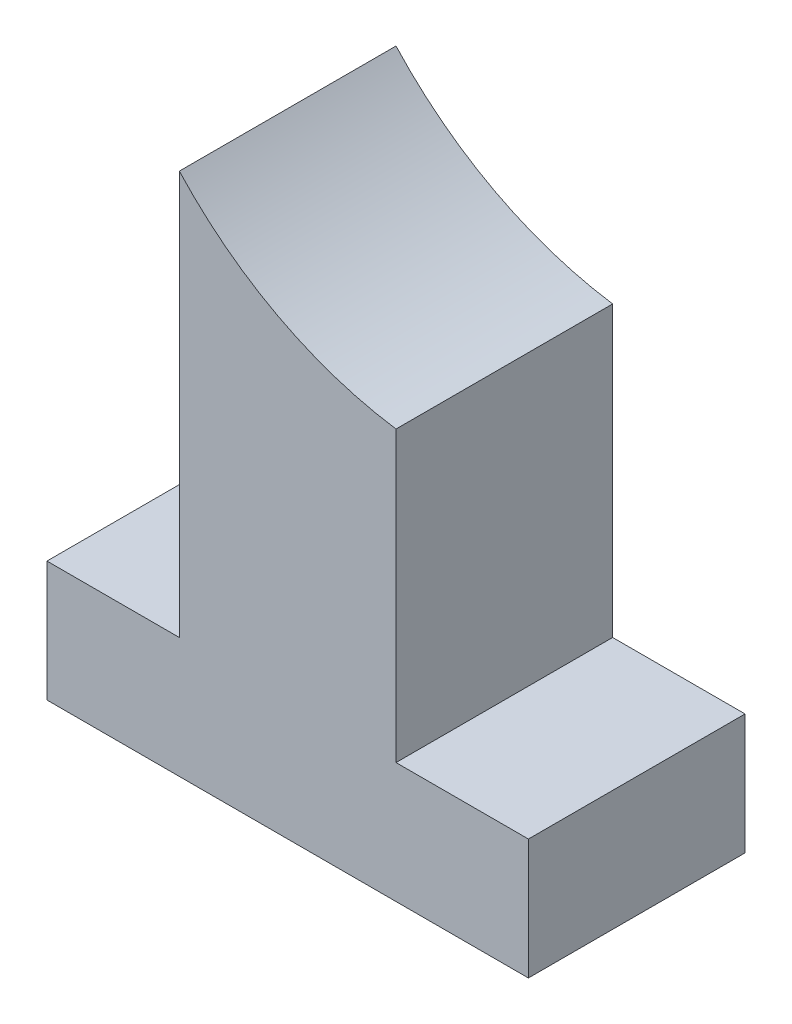
ISO-10303-21;
HEADER;
FILE_DESCRIPTION(('STEP AP214'),'2;1');
FILE_NAME('part.step','',(''),(''),'','','');
FILE_SCHEMA(('AUTOMOTIVE_DESIGN { 1 0 10303 214 1 1 1 1 }'));
ENDSEC;
DATA;
#1=APPLICATION_CONTEXT('core data for automotive mechanical design processes');
#2=APPLICATION_PROTOCOL_DEFINITION('international standard','automotive_design',2000,#1);
#3=PRODUCT_CONTEXT('',#1,'mechanical');
#4=PRODUCT('Part','Part','',(#3));
#5=PRODUCT_RELATED_PRODUCT_CATEGORY('part','',(#4));
#6=PRODUCT_DEFINITION_FORMATION('','',#4);
#7=PRODUCT_DEFINITION_CONTEXT('part definition',#1,'design');
#8=PRODUCT_DEFINITION('design','',#6,#7);
#9=PRODUCT_DEFINITION_SHAPE('','',#8);
#10=(LENGTH_UNIT() NAMED_UNIT(*) SI_UNIT(.MILLI.,.METRE.));
#11=(NAMED_UNIT(*) PLANE_ANGLE_UNIT() SI_UNIT($,.RADIAN.));
#12=(NAMED_UNIT(*) SI_UNIT($,.STERADIAN.) SOLID_ANGLE_UNIT());
#13=UNCERTAINTY_MEASURE_WITH_UNIT(LENGTH_MEASURE(1.E-05),#10,'distance_accuracy_value','');
#14=(GEOMETRIC_REPRESENTATION_CONTEXT(3) GLOBAL_UNCERTAINTY_ASSIGNED_CONTEXT((#13)) GLOBAL_UNIT_ASSIGNED_CONTEXT((#10,
#11,#12)) REPRESENTATION_CONTEXT('',''));
#15=CARTESIAN_POINT('',(0.,0.,0.));
#16=DIRECTION('',(0.,0.,1.));
#17=DIRECTION('',(1.,0.,0.));
#18=AXIS2_PLACEMENT_3D('',#15,#16,#17);
#19=CARTESIAN_POINT('',(837.293394128725,1604.69145591762,450.));
#20=DIRECTION('',(0.,0.,-1.));
#21=DIRECTION('',(-1.,0.,0.));
#22=AXIS2_PLACEMENT_3D('',#19,#20,#21);
#23=CYLINDRICAL_SURFACE('',#22,763.);
#24=CARTESIAN_POINT('',(837.293394128725,1604.69145591762,0.));
#25=DIRECTION('',(0.,0.,-1.));
#26=DIRECTION('',(1.,0.,0.));
#27=AXIS2_PLACEMENT_3D('',#24,#25,#26);
#28=CIRCLE('',#27,763.);
#29=CARTESIAN_POINT('',(725.,850.,0.));
#30=VERTEX_POINT('',#29);
#31=CARTESIAN_POINT('',(275.,1088.94429022575,0.));
#32=VERTEX_POINT('',#31);
#33=EDGE_CURVE('E140',#30,#32,#28,.T.);
#34=ORIENTED_EDGE('',*,*,#33,.T.);
#35=DIRECTION('',(0.,0.,-1.));
#36=VECTOR('',#35,1.);
#37=CARTESIAN_POINT('',(275.,1088.94429022575,450.));
#38=LINE('',#37,#36);
#39=CARTESIAN_POINT('',(275.,1088.94429022575,450.));
#40=VERTEX_POINT('',#39);
#41=EDGE_CURVE('E11',#40,#32,#38,.T.);
#42=ORIENTED_EDGE('',*,*,#41,.F.);
#43=CARTESIAN_POINT('',(837.293394128725,1604.69145591762,450.));
#44=DIRECTION('',(0.,0.,-1.));
#45=DIRECTION('',(1.,0.,0.));
#46=AXIS2_PLACEMENT_3D('',#43,#44,#45);
#47=CIRCLE('',#46,763.);
#48=CARTESIAN_POINT('',(725.,850.,450.));
#49=VERTEX_POINT('',#48);
#50=EDGE_CURVE('E162',#49,#40,#47,.T.);
#51=ORIENTED_EDGE('',*,*,#50,.F.);
#52=DIRECTION('',(0.,0.,-1.));
#53=VECTOR('',#52,1.);
#54=CARTESIAN_POINT('',(725.,850.,450.));
#55=LINE('',#54,#53);
#56=EDGE_CURVE('E136',#49,#30,#55,.T.);
#57=ORIENTED_EDGE('',*,*,#56,.T.);
#58=EDGE_LOOP('',(#34,#42,#51,#57));
#59=FACE_BOUND('',#58,.T.);
#60=ADVANCED_FACE('F39',(#59),#23,.F.);
#61=CARTESIAN_POINT('',(275.,1088.94429022575,450.));
#62=DIRECTION('',(1.,0.,0.));
#63=DIRECTION('',(0.,1.,0.));
#64=AXIS2_PLACEMENT_3D('',#61,#62,#63);
#65=PLANE('',#64);
#66=DIRECTION('',(0.,-1.,0.));
#67=VECTOR('',#66,1.);
#68=CARTESIAN_POINT('',(275.,1088.94429022575,0.));
#69=LINE('',#68,#67);
#70=CARTESIAN_POINT('',(275.,250.,0.));
#71=VERTEX_POINT('',#70);
#72=EDGE_CURVE('E144',#32,#71,#69,.T.);
#73=ORIENTED_EDGE('',*,*,#72,.T.);
#74=DIRECTION('',(0.,0.,-1.));
#75=VECTOR('',#74,1.);
#76=CARTESIAN_POINT('',(275.,250.,450.));
#77=LINE('',#76,#75);
#78=CARTESIAN_POINT('',(275.,250.,450.));
#79=VERTEX_POINT('',#78);
#80=EDGE_CURVE('E48',#79,#71,#77,.T.);
#81=ORIENTED_EDGE('',*,*,#80,.F.);
#82=DIRECTION('',(0.,-1.,0.));
#83=VECTOR('',#82,1.);
#84=CARTESIAN_POINT('',(275.,1088.94429022575,450.));
#85=LINE('',#84,#83);
#86=EDGE_CURVE('E99',#40,#79,#85,.T.);
#87=ORIENTED_EDGE('',*,*,#86,.F.);
#88=ORIENTED_EDGE('',*,*,#41,.T.);
#89=EDGE_LOOP('',(#73,#81,#87,#88));
#90=FACE_BOUND('',#89,.T.);
#91=ADVANCED_FACE('F208',(#90),#65,.F.);
#92=CARTESIAN_POINT('',(275.,250.,450.));
#93=DIRECTION('',(0.,-1.,0.));
#94=DIRECTION('',(0.,0.,-1.));
#95=AXIS2_PLACEMENT_3D('',#92,#93,#94);
#96=PLANE('',#95);
#97=DIRECTION('',(-1.,0.,0.));
#98=VECTOR('',#97,1.);
#99=CARTESIAN_POINT('',(275.,250.,0.));
#100=LINE('',#99,#98);
#101=CARTESIAN_POINT('',(-1.11022302462516E-13,250.,0.));
#102=VERTEX_POINT('',#101);
#103=EDGE_CURVE('E147',#71,#102,#100,.T.);
#104=ORIENTED_EDGE('',*,*,#103,.T.);
#105=DIRECTION('',(0.,0.,-1.));
#106=VECTOR('',#105,1.);
#107=CARTESIAN_POINT('',(-1.11022302462516E-13,250.,450.));
#108=LINE('',#107,#106);
#109=CARTESIAN_POINT('',(-1.11022302462516E-13,250.,450.));
#110=VERTEX_POINT('',#109);
#111=EDGE_CURVE('E173',#110,#102,#108,.T.);
#112=ORIENTED_EDGE('',*,*,#111,.F.);
#113=DIRECTION('',(-1.,0.,0.));
#114=VECTOR('',#113,1.);
#115=CARTESIAN_POINT('',(275.,250.,450.));
#116=LINE('',#115,#114);
#117=EDGE_CURVE('E183',#79,#110,#116,.T.);
#118=ORIENTED_EDGE('',*,*,#117,.F.);
#119=ORIENTED_EDGE('',*,*,#80,.T.);
#120=EDGE_LOOP('',(#104,#112,#118,#119));
#121=FACE_BOUND('',#120,.T.);
#122=ADVANCED_FACE('F181',(#121),#96,.F.);
#123=CARTESIAN_POINT('',(-1.11022302462516E-13,250.,450.));
#124=DIRECTION('',(1.,0.,0.));
#125=DIRECTION('',(0.,1.,0.));
#126=AXIS2_PLACEMENT_3D('',#123,#124,#125);
#127=PLANE('',#126);
#128=DIRECTION('',(0.,-1.,0.));
#129=VECTOR('',#128,1.);
#130=CARTESIAN_POINT('',(-1.11022302462516E-13,250.,0.));
#131=LINE('',#130,#129);
#132=CARTESIAN_POINT('',(0.,0.,0.));
#133=VERTEX_POINT('',#132);
#134=EDGE_CURVE('E150',#102,#133,#131,.T.);
#135=ORIENTED_EDGE('',*,*,#134,.T.);
#136=DIRECTION('',(0.,0.,-1.));
#137=VECTOR('',#136,1.);
#138=CARTESIAN_POINT('',(0.,0.,450.));
#139=LINE('',#138,#137);
#140=CARTESIAN_POINT('',(0.,0.,450.));
#141=VERTEX_POINT('',#140);
#142=EDGE_CURVE('E169',#141,#133,#139,.T.);
#143=ORIENTED_EDGE('',*,*,#142,.F.);
#144=DIRECTION('',(0.,-1.,0.));
#145=VECTOR('',#144,1.);
#146=CARTESIAN_POINT('',(-1.11022302462516E-13,250.,450.));
#147=LINE('',#146,#145);
#148=EDGE_CURVE('E196',#110,#141,#147,.T.);
#149=ORIENTED_EDGE('',*,*,#148,.F.);
#150=ORIENTED_EDGE('',*,*,#111,.T.);
#151=EDGE_LOOP('',(#135,#143,#149,#150));
#152=FACE_BOUND('',#151,.T.);
#153=ADVANCED_FACE('F191',(#152),#127,.F.);
#154=CARTESIAN_POINT('',(0.,0.,450.));
#155=DIRECTION('',(0.,1.,0.));
#156=DIRECTION('',(0.,0.,1.));
#157=AXIS2_PLACEMENT_3D('',#154,#155,#156);
#158=PLANE('',#157);
#159=DIRECTION('',(1.,0.,0.));
#160=VECTOR('',#159,1.);
#161=CARTESIAN_POINT('',(0.,0.,0.));
#162=LINE('',#161,#160);
#163=CARTESIAN_POINT('',(1000.,0.,0.));
#164=VERTEX_POINT('',#163);
#165=EDGE_CURVE('E153',#133,#164,#162,.T.);
#166=ORIENTED_EDGE('',*,*,#165,.T.);
#167=DIRECTION('',(0.,0.,-1.));
#168=VECTOR('',#167,1.);
#169=CARTESIAN_POINT('',(1000.,0.,450.));
#170=LINE('',#169,#168);
#171=CARTESIAN_POINT('',(1000.,0.,450.));
#172=VERTEX_POINT('',#171);
#173=EDGE_CURVE('E129',#172,#164,#170,.T.);
#174=ORIENTED_EDGE('',*,*,#173,.F.);
#175=DIRECTION('',(1.,0.,0.));
#176=VECTOR('',#175,1.);
#177=CARTESIAN_POINT('',(0.,0.,450.));
#178=LINE('',#177,#176);
#179=EDGE_CURVE('E118',#141,#172,#178,.T.);
#180=ORIENTED_EDGE('',*,*,#179,.F.);
#181=ORIENTED_EDGE('',*,*,#142,.T.);
#182=EDGE_LOOP('',(#166,#174,#180,#181));
#183=FACE_BOUND('',#182,.T.);
#184=ADVANCED_FACE('F194',(#183),#158,.F.);
#185=CARTESIAN_POINT('',(1000.,0.,450.));
#186=DIRECTION('',(-1.,0.,0.));
#187=DIRECTION('',(0.,0.,1.));
#188=AXIS2_PLACEMENT_3D('',#185,#186,#187);
#189=PLANE('',#188);
#190=DIRECTION('',(0.,1.,0.));
#191=VECTOR('',#190,1.);
#192=CARTESIAN_POINT('',(1000.,0.,0.));
#193=LINE('',#192,#191);
#194=CARTESIAN_POINT('',(1000.,250.,0.));
#195=VERTEX_POINT('',#194);
#196=EDGE_CURVE('E127',#164,#195,#193,.T.);
#197=ORIENTED_EDGE('',*,*,#196,.T.);
#198=DIRECTION('',(0.,0.,-1.));
#199=VECTOR('',#198,1.);
#200=CARTESIAN_POINT('',(1000.,250.,450.));
#201=LINE('',#200,#199);
#202=CARTESIAN_POINT('',(1000.,250.,450.));
#203=VERTEX_POINT('',#202);
#204=EDGE_CURVE('E124',#203,#195,#201,.T.);
#205=ORIENTED_EDGE('',*,*,#204,.F.);
#206=DIRECTION('',(0.,1.,0.));
#207=VECTOR('',#206,1.);
#208=CARTESIAN_POINT('',(1000.,0.,450.));
#209=LINE('',#208,#207);
#210=EDGE_CURVE('E112',#172,#203,#209,.T.);
#211=ORIENTED_EDGE('',*,*,#210,.F.);
#212=ORIENTED_EDGE('',*,*,#173,.T.);
#213=EDGE_LOOP('',(#197,#205,#211,#212));
#214=FACE_BOUND('',#213,.T.);
#215=ADVANCED_FACE('F125',(#214),#189,.F.);
#216=CARTESIAN_POINT('',(1000.,250.,450.));
#217=DIRECTION('',(0.,-1.,0.));
#218=DIRECTION('',(0.,0.,-1.));
#219=AXIS2_PLACEMENT_3D('',#216,#217,#218);
#220=PLANE('',#219);
#221=DIRECTION('',(-1.,0.,0.));
#222=VECTOR('',#221,1.);
#223=CARTESIAN_POINT('',(1000.,250.,0.));
#224=LINE('',#223,#222);
#225=CARTESIAN_POINT('',(725.,250.,0.));
#226=VERTEX_POINT('',#225);
#227=EDGE_CURVE('E85',#195,#226,#224,.T.);
#228=ORIENTED_EDGE('',*,*,#227,.T.);
#229=DIRECTION('',(0.,0.,-1.));
#230=VECTOR('',#229,1.);
#231=CARTESIAN_POINT('',(725.,250.,450.));
#232=LINE('',#231,#230);
#233=CARTESIAN_POINT('',(725.,250.,450.));
#234=VERTEX_POINT('',#233);
#235=EDGE_CURVE('E130',#234,#226,#232,.T.);
#236=ORIENTED_EDGE('',*,*,#235,.F.);
#237=DIRECTION('',(-1.,0.,0.));
#238=VECTOR('',#237,1.);
#239=CARTESIAN_POINT('',(1000.,250.,450.));
#240=LINE('',#239,#238);
#241=EDGE_CURVE('E116',#203,#234,#240,.T.);
#242=ORIENTED_EDGE('',*,*,#241,.F.);
#243=ORIENTED_EDGE('',*,*,#204,.T.);
#244=EDGE_LOOP('',(#228,#236,#242,#243));
#245=FACE_BOUND('',#244,.T.);
#246=ADVANCED_FACE('F132',(#245),#220,.F.);
#247=CARTESIAN_POINT('',(725.,250.,450.));
#248=DIRECTION('',(-1.,0.,0.));
#249=DIRECTION('',(0.,-1.,0.));
#250=AXIS2_PLACEMENT_3D('',#247,#248,#249);
#251=PLANE('',#250);
#252=DIRECTION('',(0.,1.,0.));
#253=VECTOR('',#252,1.);
#254=CARTESIAN_POINT('',(725.,250.,0.));
#255=LINE('',#254,#253);
#256=EDGE_CURVE('E91',#226,#30,#255,.T.);
#257=ORIENTED_EDGE('',*,*,#256,.T.);
#258=ORIENTED_EDGE('',*,*,#56,.F.);
#259=DIRECTION('',(0.,1.,0.));
#260=VECTOR('',#259,1.);
#261=CARTESIAN_POINT('',(725.,250.,450.));
#262=LINE('',#261,#260);
#263=EDGE_CURVE('E56',#234,#49,#262,.T.);
#264=ORIENTED_EDGE('',*,*,#263,.F.);
#265=ORIENTED_EDGE('',*,*,#235,.T.);
#266=EDGE_LOOP('',(#257,#258,#264,#265));
#267=FACE_BOUND('',#266,.T.);
#268=ADVANCED_FACE('F224',(#267),#251,.F.);
#269=CARTESIAN_POINT('',(837.293394128725,1604.69145591762,450.));
#270=DIRECTION('',(0.,0.,1.));
#271=DIRECTION('',(1.,0.,0.));
#272=AXIS2_PLACEMENT_3D('',#269,#270,#271);
#273=PLANE('',#272);
#274=ORIENTED_EDGE('',*,*,#50,.T.);
#275=ORIENTED_EDGE('',*,*,#86,.T.);
#276=ORIENTED_EDGE('',*,*,#117,.T.);
#277=ORIENTED_EDGE('',*,*,#148,.T.);
#278=ORIENTED_EDGE('',*,*,#179,.T.);
#279=ORIENTED_EDGE('',*,*,#210,.T.);
#280=ORIENTED_EDGE('',*,*,#241,.T.);
#281=ORIENTED_EDGE('',*,*,#263,.T.);
#282=EDGE_LOOP('',(#274,#275,#276,#277,#278,#279,#280,#281));
#283=FACE_BOUND('',#282,.T.);
#284=ADVANCED_FACE('F114',(#283),#273,.T.);
#285=CARTESIAN_POINT('',(837.293394128725,1604.69145591762,0.));
#286=DIRECTION('',(0.,0.,1.));
#287=DIRECTION('',(1.,0.,0.));
#288=AXIS2_PLACEMENT_3D('',#285,#286,#287);
#289=PLANE('',#288);
#290=ORIENTED_EDGE('',*,*,#33,.F.);
#291=ORIENTED_EDGE('',*,*,#256,.F.);
#292=ORIENTED_EDGE('',*,*,#227,.F.);
#293=ORIENTED_EDGE('',*,*,#196,.F.);
#294=ORIENTED_EDGE('',*,*,#165,.F.);
#295=ORIENTED_EDGE('',*,*,#134,.F.);
#296=ORIENTED_EDGE('',*,*,#103,.F.);
#297=ORIENTED_EDGE('',*,*,#72,.F.);
#298=EDGE_LOOP('',(#290,#291,#292,#293,#294,#295,#296,#297));
#299=FACE_BOUND('',#298,.T.);
#300=ADVANCED_FACE('F187',(#299),#289,.F.);
#301=CLOSED_SHELL('',(#60,#91,#122,#153,#184,#215,#246,#268,#284,#300));
#302=MANIFOLD_SOLID_BREP('B2',#301);
#303=ADVANCED_BREP_SHAPE_REPRESENTATION('',(#18,#302),#14);
#304=SHAPE_DEFINITION_REPRESENTATION(#9,#303);
ENDSEC;
END-ISO-10303-21;
